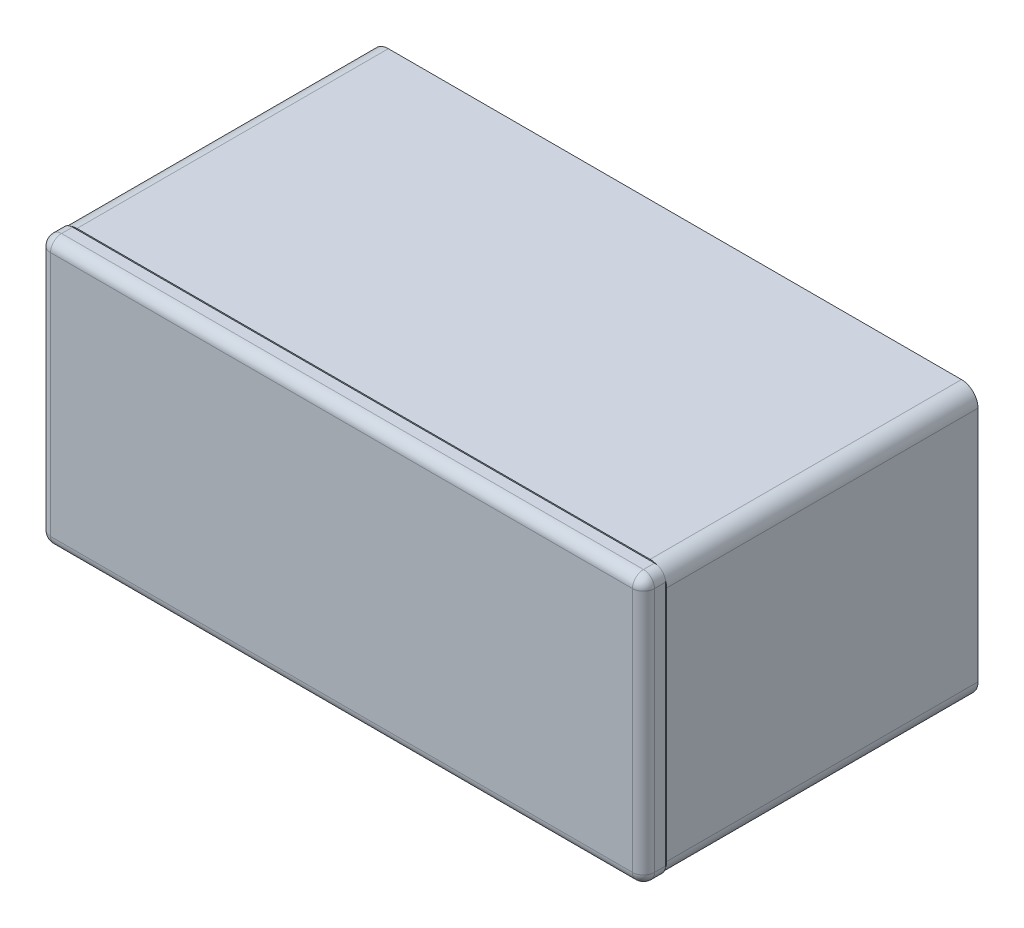
ISO-10303-21;
HEADER;
FILE_DESCRIPTION(('STEP AP214'),'2;1');
FILE_NAME('part.step','',(''),(''),'','','');
FILE_SCHEMA(('AUTOMOTIVE_DESIGN { 1 0 10303 214 1 1 1 1 }'));
ENDSEC;
DATA;
#1=APPLICATION_CONTEXT('core data for automotive mechanical design processes');
#2=APPLICATION_PROTOCOL_DEFINITION('international standard','automotive_design',2000,#1);
#3=PRODUCT_CONTEXT('',#1,'mechanical');
#4=PRODUCT('Part','Part','',(#3));
#5=PRODUCT_RELATED_PRODUCT_CATEGORY('part','',(#4));
#6=PRODUCT_DEFINITION_FORMATION('','',#4);
#7=PRODUCT_DEFINITION_CONTEXT('part definition',#1,'design');
#8=PRODUCT_DEFINITION('design','',#6,#7);
#9=PRODUCT_DEFINITION_SHAPE('','',#8);
#10=(LENGTH_UNIT() NAMED_UNIT(*) SI_UNIT(.MILLI.,.METRE.));
#11=(NAMED_UNIT(*) PLANE_ANGLE_UNIT() SI_UNIT($,.RADIAN.));
#12=(NAMED_UNIT(*) SI_UNIT($,.STERADIAN.) SOLID_ANGLE_UNIT());
#13=UNCERTAINTY_MEASURE_WITH_UNIT(LENGTH_MEASURE(1.E-05),#10,'distance_accuracy_value','');
#14=(GEOMETRIC_REPRESENTATION_CONTEXT(3) GLOBAL_UNCERTAINTY_ASSIGNED_CONTEXT((#13)) GLOBAL_UNIT_ASSIGNED_CONTEXT((#10,
#11,#12)) REPRESENTATION_CONTEXT('',''));
#15=CARTESIAN_POINT('',(0.,0.,0.));
#16=DIRECTION('',(0.,0.,1.));
#17=DIRECTION('',(1.,0.,0.));
#18=AXIS2_PLACEMENT_3D('',#15,#16,#17);
#19=CARTESIAN_POINT('',(-52.8,-22.3,58.5));
#20=DIRECTION('',(-0.707106779020598,-0.707106783352498,0.));
#21=DIRECTION('',(0.,0.,1.));
#22=AXIS2_PLACEMENT_3D('',#19,#20,#21);
#23=SPHERICAL_SURFACE('',#22,2.);
#24=CARTESIAN_POINT('',(-52.8,-22.3,58.5));
#25=DIRECTION('',(6.065092872376E-12,-6.06514838352723E-12,1.));
#26=DIRECTION('',(-0.707106779020598,-0.707106783352498,0.));
#27=AXIS2_PLACEMENT_3D('',#24,#25,#26);
#28=CIRCLE('',#27,2.);
#29=CARTESIAN_POINT('',(-54.2142135580412,-23.714213566705,58.5));
#30=VERTEX_POINT('',#29);
#31=CARTESIAN_POINT('',(-52.8,-24.3,58.4999999999939));
#32=VERTEX_POINT('',#31);
#33=EDGE_CURVE('E139',#30,#32,#28,.T.);
#34=ORIENTED_EDGE('',*,*,#33,.T.);
#35=CARTESIAN_POINT('',(-52.8,-22.3,58.5));
#36=DIRECTION('',(1.,0.,0.));
#37=DIRECTION('',(0.,0.,-1.));
#38=AXIS2_PLACEMENT_3D('',#35,#36,#37);
#39=CIRCLE('',#38,2.);
#40=CARTESIAN_POINT('',(-52.8,-22.3,60.5));
#41=VERTEX_POINT('',#40);
#42=EDGE_CURVE('E145',#41,#32,#39,.T.);
#43=ORIENTED_EDGE('',*,*,#42,.F.);
#44=CARTESIAN_POINT('',(-52.8,-22.3,58.5));
#45=DIRECTION('',(0.,-1.,0.));
#46=DIRECTION('',(0.,0.,-1.));
#47=AXIS2_PLACEMENT_3D('',#44,#45,#46);
#48=CIRCLE('',#47,2.);
#49=CARTESIAN_POINT('',(-54.8,-22.3,58.5));
#50=VERTEX_POINT('',#49);
#51=EDGE_CURVE('E142',#50,#41,#48,.F.);
#52=ORIENTED_EDGE('',*,*,#51,.F.);
#53=CARTESIAN_POINT('',(-52.8,-22.3,58.5));
#54=DIRECTION('',(0.,0.,-1.));
#55=DIRECTION('',(-1.,0.,0.));
#56=AXIS2_PLACEMENT_3D('',#53,#54,#55);
#57=CIRCLE('',#56,2.);
#58=EDGE_CURVE('E21',#50,#30,#57,.F.);
#59=ORIENTED_EDGE('',*,*,#58,.T.);
#60=EDGE_LOOP('',(#34,#43,#52,#59));
#61=FACE_BOUND('',#60,.T.);
#62=ADVANCED_FACE('F17',(#61),#23,.T.);
#63=CARTESIAN_POINT('',(52.8,-22.3,58.5));
#64=DIRECTION('',(0.707106783352498,-0.707106779020598,0.));
#65=DIRECTION('',(0.,0.,1.));
#66=AXIS2_PLACEMENT_3D('',#63,#64,#65);
#67=SPHERICAL_SURFACE('',#66,2.);
#68=CARTESIAN_POINT('',(52.8,-22.3,58.5));
#69=DIRECTION('',(8.2093221109858E-12,8.20926659983456E-12,1.));
#70=DIRECTION('',(0.707106783352498,-0.707106779020598,0.));
#71=AXIS2_PLACEMENT_3D('',#68,#69,#70);
#72=CIRCLE('',#71,2.);
#73=CARTESIAN_POINT('',(54.214213566705,-23.7142135580412,58.5));
#74=VERTEX_POINT('',#73);
#75=CARTESIAN_POINT('',(54.8,-22.3,58.4999999999918));
#76=VERTEX_POINT('',#75);
#77=EDGE_CURVE('E183',#74,#76,#72,.T.);
#78=ORIENTED_EDGE('',*,*,#77,.T.);
#79=CARTESIAN_POINT('',(52.8,-22.3,58.5));
#80=DIRECTION('',(0.,1.,0.));
#81=DIRECTION('',(0.,0.,1.));
#82=AXIS2_PLACEMENT_3D('',#79,#80,#81);
#83=CIRCLE('',#82,2.);
#84=CARTESIAN_POINT('',(52.8,-22.3,60.5));
#85=VERTEX_POINT('',#84);
#86=EDGE_CURVE('E149',#85,#76,#83,.T.);
#87=ORIENTED_EDGE('',*,*,#86,.F.);
#88=CARTESIAN_POINT('',(52.8,-22.3,58.5));
#89=DIRECTION('',(1.,0.,0.));
#90=DIRECTION('',(0.,0.,-1.));
#91=AXIS2_PLACEMENT_3D('',#88,#89,#90);
#92=CIRCLE('',#91,2.);
#93=CARTESIAN_POINT('',(52.8,-24.3,58.5));
#94=VERTEX_POINT('',#93);
#95=EDGE_CURVE('E150',#94,#85,#92,.F.);
#96=ORIENTED_EDGE('',*,*,#95,.F.);
#97=CARTESIAN_POINT('',(52.8,-22.3,58.5));
#98=DIRECTION('',(0.,0.,-1.));
#99=DIRECTION('',(-1.,0.,0.));
#100=AXIS2_PLACEMENT_3D('',#97,#98,#99);
#101=CIRCLE('',#100,2.);
#102=EDGE_CURVE('E271',#94,#74,#101,.F.);
#103=ORIENTED_EDGE('',*,*,#102,.T.);
#104=EDGE_LOOP('',(#78,#87,#96,#103));
#105=FACE_BOUND('',#104,.T.);
#106=ADVANCED_FACE('F184',(#105),#67,.T.);
#107=CARTESIAN_POINT('',(-53.00721512968,-22.3,58.5));
#108=DIRECTION('',(1.,0.,0.));
#109=DIRECTION('',(0.,0.,-1.));
#110=AXIS2_PLACEMENT_3D('',#107,#108,#109);
#111=CYLINDRICAL_SURFACE('',#110,2.);
#112=ORIENTED_EDGE('',*,*,#95,.T.);
#113=DIRECTION('',(1.,0.,0.));
#114=VECTOR('',#113,1.);
#115=CARTESIAN_POINT('',(0.,-22.3,60.5));
#116=LINE('',#115,#114);
#117=EDGE_CURVE('E175',#41,#85,#116,.T.);
#118=ORIENTED_EDGE('',*,*,#117,.F.);
#119=ORIENTED_EDGE('',*,*,#42,.T.);
#120=DIRECTION('',(1.,0.,0.));
#121=VECTOR('',#120,1.);
#122=CARTESIAN_POINT('',(-54.8,-24.3,58.5));
#123=LINE('',#122,#121);
#124=EDGE_CURVE('E172',#94,#32,#123,.F.);
#125=ORIENTED_EDGE('',*,*,#124,.F.);
#126=EDGE_LOOP('',(#112,#118,#119,#125));
#127=FACE_BOUND('',#126,.T.);
#128=ADVANCED_FACE('F187',(#127),#111,.T.);
#129=CARTESIAN_POINT('',(-52.8,22.50721512968,58.5));
#130=DIRECTION('',(0.,-1.,0.));
#131=DIRECTION('',(0.,0.,-1.));
#132=AXIS2_PLACEMENT_3D('',#129,#130,#131);
#133=CYLINDRICAL_SURFACE('',#132,2.);
#134=ORIENTED_EDGE('',*,*,#51,.T.);
#135=DIRECTION('',(0.,1.,0.));
#136=VECTOR('',#135,1.);
#137=CARTESIAN_POINT('',(-52.8,0.,60.5));
#138=LINE('',#137,#136);
#139=CARTESIAN_POINT('',(-52.8,22.3,60.5));
#140=VERTEX_POINT('',#139);
#141=EDGE_CURVE('E221',#140,#41,#138,.F.);
#142=ORIENTED_EDGE('',*,*,#141,.F.);
#143=CARTESIAN_POINT('',(-52.8,22.3,58.5));
#144=DIRECTION('',(0.,-1.,0.));
#145=DIRECTION('',(0.,0.,-1.));
#146=AXIS2_PLACEMENT_3D('',#143,#144,#145);
#147=CIRCLE('',#146,2.);
#148=CARTESIAN_POINT('',(-54.8,22.3,58.5));
#149=VERTEX_POINT('',#148);
#150=EDGE_CURVE('E156',#149,#140,#147,.F.);
#151=ORIENTED_EDGE('',*,*,#150,.F.);
#152=DIRECTION('',(0.,1.,0.));
#153=VECTOR('',#152,1.);
#154=CARTESIAN_POINT('',(-54.8,24.3,58.5));
#155=LINE('',#154,#153);
#156=EDGE_CURVE('E153',#50,#149,#155,.T.);
#157=ORIENTED_EDGE('',*,*,#156,.F.);
#158=EDGE_LOOP('',(#134,#142,#151,#157));
#159=FACE_BOUND('',#158,.T.);
#160=ADVANCED_FACE('F154',(#159),#133,.T.);
#161=CARTESIAN_POINT('',(52.8,-22.50721512968,58.5));
#162=DIRECTION('',(0.,1.,0.));
#163=DIRECTION('',(0.,0.,1.));
#164=AXIS2_PLACEMENT_3D('',#161,#162,#163);
#165=CYLINDRICAL_SURFACE('',#164,2.);
#166=CARTESIAN_POINT('',(52.8,22.3,58.5));
#167=DIRECTION('',(0.,1.,0.));
#168=DIRECTION('',(0.,0.,1.));
#169=AXIS2_PLACEMENT_3D('',#166,#167,#168);
#170=CIRCLE('',#169,2.);
#171=CARTESIAN_POINT('',(52.8,22.3,60.5));
#172=VERTEX_POINT('',#171);
#173=CARTESIAN_POINT('',(54.8,22.3,58.5));
#174=VERTEX_POINT('',#173);
#175=EDGE_CURVE('E159',#172,#174,#170,.T.);
#176=ORIENTED_EDGE('',*,*,#175,.F.);
#177=DIRECTION('',(0.,1.,0.));
#178=VECTOR('',#177,1.);
#179=CARTESIAN_POINT('',(52.8,0.,60.5));
#180=LINE('',#179,#178);
#181=EDGE_CURVE('E178',#85,#172,#180,.T.);
#182=ORIENTED_EDGE('',*,*,#181,.F.);
#183=ORIENTED_EDGE('',*,*,#86,.T.);
#184=DIRECTION('',(0.,1.,0.));
#185=VECTOR('',#184,1.);
#186=CARTESIAN_POINT('',(54.8,-24.3,58.5));
#187=LINE('',#186,#185);
#188=EDGE_CURVE('E258',#174,#76,#187,.F.);
#189=ORIENTED_EDGE('',*,*,#188,.F.);
#190=EDGE_LOOP('',(#176,#182,#183,#189));
#191=FACE_BOUND('',#190,.T.);
#192=ADVANCED_FACE('F194',(#191),#165,.T.);
#193=CARTESIAN_POINT('',(-52.8,-22.3,60.71086977455));
#194=DIRECTION('',(0.,0.,-1.));
#195=DIRECTION('',(-1.,0.,0.));
#196=AXIS2_PLACEMENT_3D('',#193,#194,#195);
#197=CYLINDRICAL_SURFACE('',#196,2.);
#198=DIRECTION('',(0.,0.,-1.));
#199=VECTOR('',#198,1.);
#200=CARTESIAN_POINT('',(-52.8,-24.3,56.5));
#201=LINE('',#200,#199);
#202=CARTESIAN_POINT('',(-52.8,-24.3,56.5));
#203=VERTEX_POINT('',#202);
#204=EDGE_CURVE('E169',#32,#203,#201,.T.);
#205=ORIENTED_EDGE('',*,*,#204,.F.);
#206=ORIENTED_EDGE('',*,*,#33,.F.);
#207=ORIENTED_EDGE('',*,*,#58,.F.);
#208=DIRECTION('',(0.,0.,1.));
#209=VECTOR('',#208,1.);
#210=CARTESIAN_POINT('',(-54.8,-22.3,56.5));
#211=LINE('',#210,#209);
#212=CARTESIAN_POINT('',(-54.8,-22.3,56.5));
#213=VERTEX_POINT('',#212);
#214=EDGE_CURVE('E137',#213,#50,#211,.T.);
#215=ORIENTED_EDGE('',*,*,#214,.F.);
#216=CARTESIAN_POINT('',(-52.8,-22.3,56.5));
#217=DIRECTION('',(0.,0.,-1.));
#218=DIRECTION('',(-1.,0.,0.));
#219=AXIS2_PLACEMENT_3D('',#216,#217,#218);
#220=CIRCLE('',#219,2.);
#221=CARTESIAN_POINT('',(-54.7678531833917,-22.6571468166091,56.5));
#222=VERTEX_POINT('',#221);
#223=EDGE_CURVE('E265',#213,#222,#220,.F.);
#224=ORIENTED_EDGE('',*,*,#223,.T.);
#225=CARTESIAN_POINT('',(-52.8,-22.3,56.5));
#226=DIRECTION('',(0.,0.,-1.));
#227=DIRECTION('',(-1.,0.,0.));
#228=AXIS2_PLACEMENT_3D('',#225,#226,#227);
#229=CIRCLE('',#228,2.);
#230=CARTESIAN_POINT('',(-53.1571468166091,-24.2678531833917,56.5));
#231=VERTEX_POINT('',#230);
#232=EDGE_CURVE('E255',#222,#231,#229,.F.);
#233=ORIENTED_EDGE('',*,*,#232,.T.);
#234=CARTESIAN_POINT('',(-52.8,-22.3,56.5));
#235=DIRECTION('',(0.,0.,-1.));
#236=DIRECTION('',(-1.,0.,0.));
#237=AXIS2_PLACEMENT_3D('',#234,#235,#236);
#238=CIRCLE('',#237,2.);
#239=EDGE_CURVE('E173',#231,#203,#238,.F.);
#240=ORIENTED_EDGE('',*,*,#239,.T.);
#241=EDGE_LOOP('',(#205,#206,#207,#215,#224,#233,#240));
#242=FACE_BOUND('',#241,.T.);
#243=ADVANCED_FACE('F135',(#242),#197,.T.);
#244=CARTESIAN_POINT('',(-54.8,-24.3,56.5));
#245=DIRECTION('',(0.,-1.,0.));
#246=DIRECTION('',(0.,0.,-1.));
#247=AXIS2_PLACEMENT_3D('',#244,#245,#246);
#248=PLANE('',#247);
#249=DIRECTION('',(0.,0.,-1.));
#250=VECTOR('',#249,1.);
#251=CARTESIAN_POINT('',(52.8,-24.3,60.71086977455));
#252=LINE('',#251,#250);
#253=CARTESIAN_POINT('',(52.8,-24.3,56.5));
#254=VERTEX_POINT('',#253);
#255=EDGE_CURVE('E165',#94,#254,#252,.T.);
#256=ORIENTED_EDGE('',*,*,#255,.F.);
#257=ORIENTED_EDGE('',*,*,#124,.T.);
#258=ORIENTED_EDGE('',*,*,#204,.T.);
#259=DIRECTION('',(1.,0.,0.));
#260=VECTOR('',#259,1.);
#261=CARTESIAN_POINT('',(0.,-24.3,56.5));
#262=LINE('',#261,#260);
#263=EDGE_CURVE('E248',#254,#203,#262,.F.);
#264=ORIENTED_EDGE('',*,*,#263,.F.);
#265=EDGE_LOOP('',(#256,#257,#258,#264));
#266=FACE_BOUND('',#265,.T.);
#267=ADVANCED_FACE('F200',(#266),#248,.T.);
#268=CARTESIAN_POINT('',(52.8,-22.3,60.71086977455));
#269=DIRECTION('',(0.,0.,-1.));
#270=DIRECTION('',(-1.,0.,0.));
#271=AXIS2_PLACEMENT_3D('',#268,#269,#270);
#272=CYLINDRICAL_SURFACE('',#271,2.);
#273=DIRECTION('',(0.,0.,-1.));
#274=VECTOR('',#273,1.);
#275=CARTESIAN_POINT('',(54.8,-22.3,56.5));
#276=LINE('',#275,#274);
#277=CARTESIAN_POINT('',(54.8,-22.3,56.5));
#278=VERTEX_POINT('',#277);
#279=EDGE_CURVE('E397',#76,#278,#276,.T.);
#280=ORIENTED_EDGE('',*,*,#279,.F.);
#281=ORIENTED_EDGE('',*,*,#77,.F.);
#282=ORIENTED_EDGE('',*,*,#102,.F.);
#283=ORIENTED_EDGE('',*,*,#255,.T.);
#284=CARTESIAN_POINT('',(52.8,-22.3,56.5));
#285=DIRECTION('',(0.,0.,-1.));
#286=DIRECTION('',(-1.,0.,0.));
#287=AXIS2_PLACEMENT_3D('',#284,#285,#286);
#288=CIRCLE('',#287,2.);
#289=CARTESIAN_POINT('',(53.1571468166091,-24.2678531833917,56.5));
#290=VERTEX_POINT('',#289);
#291=EDGE_CURVE('E249',#290,#254,#288,.T.);
#292=ORIENTED_EDGE('',*,*,#291,.F.);
#293=CARTESIAN_POINT('',(52.8,-22.3,56.5));
#294=DIRECTION('',(0.,0.,-1.));
#295=DIRECTION('',(-1.,0.,0.));
#296=AXIS2_PLACEMENT_3D('',#293,#294,#295);
#297=CIRCLE('',#296,2.);
#298=CARTESIAN_POINT('',(54.7678531833917,-22.6571468166091,56.5));
#299=VERTEX_POINT('',#298);
#300=EDGE_CURVE('E245',#290,#299,#297,.F.);
#301=ORIENTED_EDGE('',*,*,#300,.T.);
#302=CARTESIAN_POINT('',(52.8,-22.3,56.5));
#303=DIRECTION('',(0.,0.,-1.));
#304=DIRECTION('',(-1.,0.,0.));
#305=AXIS2_PLACEMENT_3D('',#302,#303,#304);
#306=CIRCLE('',#305,2.);
#307=EDGE_CURVE('E163',#299,#278,#306,.F.);
#308=ORIENTED_EDGE('',*,*,#307,.T.);
#309=EDGE_LOOP('',(#280,#281,#282,#283,#292,#301,#308));
#310=FACE_BOUND('',#309,.T.);
#311=ADVANCED_FACE('F203',(#310),#272,.T.);
#312=CARTESIAN_POINT('',(-54.8,24.3,56.5));
#313=DIRECTION('',(-1.,0.,0.));
#314=DIRECTION('',(0.,0.,1.));
#315=AXIS2_PLACEMENT_3D('',#312,#313,#314);
#316=PLANE('',#315);
#317=ORIENTED_EDGE('',*,*,#214,.T.);
#318=ORIENTED_EDGE('',*,*,#156,.T.);
#319=DIRECTION('',(0.,0.,-1.));
#320=VECTOR('',#319,1.);
#321=CARTESIAN_POINT('',(-54.8,22.3,60.71086977455));
#322=LINE('',#321,#320);
#323=CARTESIAN_POINT('',(-54.8,22.3,56.5));
#324=VERTEX_POINT('',#323);
#325=EDGE_CURVE('E228',#324,#149,#322,.F.);
#326=ORIENTED_EDGE('',*,*,#325,.F.);
#327=DIRECTION('',(0.,1.,0.));
#328=VECTOR('',#327,1.);
#329=CARTESIAN_POINT('',(-54.8,0.,56.5));
#330=LINE('',#329,#328);
#331=EDGE_CURVE('E162',#213,#324,#330,.T.);
#332=ORIENTED_EDGE('',*,*,#331,.F.);
#333=EDGE_LOOP('',(#317,#318,#326,#332));
#334=FACE_BOUND('',#333,.T.);
#335=ADVANCED_FACE('F161',(#334),#316,.T.);
#336=CARTESIAN_POINT('',(52.8,22.3,58.5));
#337=DIRECTION('',(0.707106779020598,0.707106783352498,0.));
#338=DIRECTION('',(0.,0.,1.));
#339=AXIS2_PLACEMENT_3D('',#336,#337,#338);
#340=SPHERICAL_SURFACE('',#339,2.);
#341=CARTESIAN_POINT('',(52.8,22.3,58.5));
#342=DIRECTION('',(-6.065092872376E-12,6.06514838352723E-12,1.));
#343=DIRECTION('',(0.707106779020598,0.707106783352498,0.));
#344=AXIS2_PLACEMENT_3D('',#341,#342,#343);
#345=CIRCLE('',#344,2.);
#346=CARTESIAN_POINT('',(54.2142135580412,23.714213566705,58.5));
#347=VERTEX_POINT('',#346);
#348=CARTESIAN_POINT('',(52.8,24.3,58.4999999999939));
#349=VERTEX_POINT('',#348);
#350=EDGE_CURVE('E223',#347,#349,#345,.T.);
#351=ORIENTED_EDGE('',*,*,#350,.T.);
#352=CARTESIAN_POINT('',(52.8,22.3,58.5));
#353=DIRECTION('',(-1.,0.,0.));
#354=DIRECTION('',(0.,0.,1.));
#355=AXIS2_PLACEMENT_3D('',#352,#353,#354);
#356=CIRCLE('',#355,2.);
#357=EDGE_CURVE('E348',#172,#349,#356,.T.);
#358=ORIENTED_EDGE('',*,*,#357,.F.);
#359=ORIENTED_EDGE('',*,*,#175,.T.);
#360=CARTESIAN_POINT('',(52.8,22.3,58.5));
#361=DIRECTION('',(0.,0.,-1.));
#362=DIRECTION('',(-1.,0.,0.));
#363=AXIS2_PLACEMENT_3D('',#360,#361,#362);
#364=CIRCLE('',#363,2.);
#365=EDGE_CURVE('E226',#174,#347,#364,.F.);
#366=ORIENTED_EDGE('',*,*,#365,.T.);
#367=EDGE_LOOP('',(#351,#358,#359,#366));
#368=FACE_BOUND('',#367,.T.);
#369=ADVANCED_FACE('F210',(#368),#340,.T.);
#370=CARTESIAN_POINT('',(-52.8,22.3,58.5));
#371=DIRECTION('',(-0.707106783352498,0.707106779020598,0.));
#372=DIRECTION('',(0.,0.,1.));
#373=AXIS2_PLACEMENT_3D('',#370,#371,#372);
#374=SPHERICAL_SURFACE('',#373,2.);
#375=ORIENTED_EDGE('',*,*,#150,.T.);
#376=CARTESIAN_POINT('',(-52.8,22.3,58.5));
#377=DIRECTION('',(-1.,0.,0.));
#378=DIRECTION('',(0.,0.,1.));
#379=AXIS2_PLACEMENT_3D('',#376,#377,#378);
#380=CIRCLE('',#379,2.);
#381=CARTESIAN_POINT('',(-52.8,24.3,58.5));
#382=VERTEX_POINT('',#381);
#383=EDGE_CURVE('E346',#382,#140,#380,.F.);
#384=ORIENTED_EDGE('',*,*,#383,.F.);
#385=CARTESIAN_POINT('',(-52.8,22.3,58.5));
#386=DIRECTION('',(0.,0.,-1.));
#387=DIRECTION('',(-1.,0.,0.));
#388=AXIS2_PLACEMENT_3D('',#385,#386,#387);
#389=CIRCLE('',#388,2.);
#390=CARTESIAN_POINT('',(-54.214213566705,23.7142135580412,58.5));
#391=VERTEX_POINT('',#390);
#392=EDGE_CURVE('E36',#391,#382,#389,.T.);
#393=ORIENTED_EDGE('',*,*,#392,.F.);
#394=CARTESIAN_POINT('',(-52.8,22.3,58.5));
#395=DIRECTION('',(0.,0.,-1.));
#396=DIRECTION('',(-1.,0.,0.));
#397=AXIS2_PLACEMENT_3D('',#394,#395,#396);
#398=CIRCLE('',#397,2.);
#399=EDGE_CURVE('E230',#149,#391,#398,.T.);
#400=ORIENTED_EDGE('',*,*,#399,.F.);
#401=EDGE_LOOP('',(#375,#384,#393,#400));
#402=FACE_BOUND('',#401,.T.);
#403=ADVANCED_FACE('F214',(#402),#374,.T.);
#404=CARTESIAN_POINT('',(0.,0.,60.5));
#405=DIRECTION('',(0.,0.,1.));
#406=DIRECTION('',(1.,0.,0.));
#407=AXIS2_PLACEMENT_3D('',#404,#405,#406);
#408=PLANE('',#407);
#409=DIRECTION('',(-1.,0.,0.));
#410=VECTOR('',#409,1.);
#411=CARTESIAN_POINT('',(53.00721512968,22.3,60.5));
#412=LINE('',#411,#410);
#413=EDGE_CURVE('E345',#140,#172,#412,.F.);
#414=ORIENTED_EDGE('',*,*,#413,.F.);
#415=ORIENTED_EDGE('',*,*,#141,.T.);
#416=ORIENTED_EDGE('',*,*,#117,.T.);
#417=ORIENTED_EDGE('',*,*,#181,.T.);
#418=EDGE_LOOP('',(#414,#415,#416,#417));
#419=FACE_BOUND('',#418,.T.);
#420=ADVANCED_FACE('F402',(#419),#408,.T.);
#421=CARTESIAN_POINT('',(54.8,-24.3,56.5));
#422=DIRECTION('',(1.,0.,0.));
#423=DIRECTION('',(0.,0.,-1.));
#424=AXIS2_PLACEMENT_3D('',#421,#422,#423);
#425=PLANE('',#424);
#426=DIRECTION('',(0.,0.,-1.));
#427=VECTOR('',#426,1.);
#428=CARTESIAN_POINT('',(54.8,22.3,60.71086977455));
#429=LINE('',#428,#427);
#430=CARTESIAN_POINT('',(54.8,22.3,56.5));
#431=VERTEX_POINT('',#430);
#432=EDGE_CURVE('E340',#174,#431,#429,.T.);
#433=ORIENTED_EDGE('',*,*,#432,.F.);
#434=ORIENTED_EDGE('',*,*,#188,.T.);
#435=ORIENTED_EDGE('',*,*,#279,.T.);
#436=DIRECTION('',(0.,1.,0.));
#437=VECTOR('',#436,1.);
#438=CARTESIAN_POINT('',(54.8,0.,56.5));
#439=LINE('',#438,#437);
#440=EDGE_CURVE('E344',#431,#278,#439,.F.);
#441=ORIENTED_EDGE('',*,*,#440,.F.);
#442=EDGE_LOOP('',(#433,#434,#435,#441));
#443=FACE_BOUND('',#442,.T.);
#444=ADVANCED_FACE('F560',(#443),#425,.T.);
#445=CARTESIAN_POINT('',(0.,0.,56.5));
#446=DIRECTION('',(0.,0.,1.));
#447=DIRECTION('',(1.,0.,0.));
#448=AXIS2_PLACEMENT_3D('',#445,#446,#447);
#449=PLANE('',#448);
#450=ORIENTED_EDGE('',*,*,#232,.F.);
#451=CARTESIAN_POINT('',(-52.,-21.5,56.5));
#452=DIRECTION('',(0.,0.,-1.));
#453=DIRECTION('',(-1.,0.,0.));
#454=AXIS2_PLACEMENT_3D('',#451,#452,#453);
#455=CIRCLE('',#454,3.);
#456=EDGE_CURVE('E328',#231,#222,#455,.T.);
#457=ORIENTED_EDGE('',*,*,#456,.F.);
#458=EDGE_LOOP('',(#450,#457));
#459=FACE_BOUND('',#458,.T.);
#460=ADVANCED_FACE('F461',(#459),#449,.F.);
#461=CARTESIAN_POINT('',(0.,0.,56.5));
#462=DIRECTION('',(0.,0.,1.));
#463=DIRECTION('',(1.,0.,0.));
#464=AXIS2_PLACEMENT_3D('',#461,#462,#463);
#465=PLANE('',#464);
#466=ORIENTED_EDGE('',*,*,#239,.F.);
#467=CARTESIAN_POINT('',(-52.,-21.5,56.5));
#468=DIRECTION('',(0.,0.,-1.));
#469=DIRECTION('',(-1.,0.,0.));
#470=AXIS2_PLACEMENT_3D('',#467,#468,#469);
#471=CIRCLE('',#470,3.);
#472=CARTESIAN_POINT('',(-52.,-24.5,56.5));
#473=VERTEX_POINT('',#472);
#474=EDGE_CURVE('E331',#473,#231,#471,.T.);
#475=ORIENTED_EDGE('',*,*,#474,.F.);
#476=DIRECTION('',(1.,0.,0.));
#477=VECTOR('',#476,1.);
#478=CARTESIAN_POINT('',(-55.,-24.5,56.5));
#479=LINE('',#478,#477);
#480=CARTESIAN_POINT('',(52.,-24.5,56.5));
#481=VERTEX_POINT('',#480);
#482=EDGE_CURVE('E327',#481,#473,#479,.F.);
#483=ORIENTED_EDGE('',*,*,#482,.F.);
#484=CARTESIAN_POINT('',(52.,-21.5,56.5));
#485=DIRECTION('',(0.,0.,-1.));
#486=DIRECTION('',(-1.,0.,0.));
#487=AXIS2_PLACEMENT_3D('',#484,#485,#486);
#488=CIRCLE('',#487,3.);
#489=EDGE_CURVE('E252',#481,#290,#488,.F.);
#490=ORIENTED_EDGE('',*,*,#489,.T.);
#491=ORIENTED_EDGE('',*,*,#291,.T.);
#492=ORIENTED_EDGE('',*,*,#263,.T.);
#493=EDGE_LOOP('',(#466,#475,#483,#490,#491,#492));
#494=FACE_BOUND('',#493,.T.);
#495=ADVANCED_FACE('F455',(#494),#465,.T.);
#496=CARTESIAN_POINT('',(0.,0.,56.5));
#497=DIRECTION('',(0.,0.,1.));
#498=DIRECTION('',(1.,0.,0.));
#499=AXIS2_PLACEMENT_3D('',#496,#497,#498);
#500=PLANE('',#499);
#501=ORIENTED_EDGE('',*,*,#300,.F.);
#502=CARTESIAN_POINT('',(52.,-21.5,56.5));
#503=DIRECTION('',(0.,0.,-1.));
#504=DIRECTION('',(-1.,0.,0.));
#505=AXIS2_PLACEMENT_3D('',#502,#503,#504);
#506=CIRCLE('',#505,3.);
#507=EDGE_CURVE('E316',#299,#290,#506,.T.);
#508=ORIENTED_EDGE('',*,*,#507,.F.);
#509=EDGE_LOOP('',(#501,#508));
#510=FACE_BOUND('',#509,.T.);
#511=ADVANCED_FACE('F552',(#510),#500,.F.);
#512=CARTESIAN_POINT('',(0.,0.,56.5));
#513=DIRECTION('',(0.,0.,1.));
#514=DIRECTION('',(1.,0.,0.));
#515=AXIS2_PLACEMENT_3D('',#512,#513,#514);
#516=PLANE('',#515);
#517=ORIENTED_EDGE('',*,*,#223,.F.);
#518=ORIENTED_EDGE('',*,*,#331,.T.);
#519=CARTESIAN_POINT('',(-52.8,22.3,56.5));
#520=DIRECTION('',(0.,0.,-1.));
#521=DIRECTION('',(-1.,0.,0.));
#522=AXIS2_PLACEMENT_3D('',#519,#520,#521);
#523=CIRCLE('',#522,2.);
#524=CARTESIAN_POINT('',(-54.7678531833917,22.6571468166091,56.5));
#525=VERTEX_POINT('',#524);
#526=EDGE_CURVE('E231',#525,#324,#523,.F.);
#527=ORIENTED_EDGE('',*,*,#526,.F.);
#528=CARTESIAN_POINT('',(-52.,21.5,56.5));
#529=DIRECTION('',(0.,0.,-1.));
#530=DIRECTION('',(-1.,0.,0.));
#531=AXIS2_PLACEMENT_3D('',#528,#529,#530);
#532=CIRCLE('',#531,3.);
#533=CARTESIAN_POINT('',(-55.,21.5,56.5));
#534=VERTEX_POINT('',#533);
#535=EDGE_CURVE('E243',#525,#534,#532,.F.);
#536=ORIENTED_EDGE('',*,*,#535,.T.);
#537=DIRECTION('',(0.,1.,0.));
#538=VECTOR('',#537,1.);
#539=CARTESIAN_POINT('',(-55.,24.5,56.5));
#540=LINE('',#539,#538);
#541=CARTESIAN_POINT('',(-55.,-21.5,56.5));
#542=VERTEX_POINT('',#541);
#543=EDGE_CURVE('E315',#542,#534,#540,.T.);
#544=ORIENTED_EDGE('',*,*,#543,.F.);
#545=CARTESIAN_POINT('',(-52.,-21.5,56.5));
#546=DIRECTION('',(0.,0.,-1.));
#547=DIRECTION('',(-1.,0.,0.));
#548=AXIS2_PLACEMENT_3D('',#545,#546,#547);
#549=CIRCLE('',#548,3.);
#550=EDGE_CURVE('E324',#222,#542,#549,.T.);
#551=ORIENTED_EDGE('',*,*,#550,.F.);
#552=EDGE_LOOP('',(#517,#518,#527,#536,#544,#551));
#553=FACE_BOUND('',#552,.T.);
#554=ADVANCED_FACE('F463',(#553),#516,.T.);
#555=CARTESIAN_POINT('',(-52.8,22.3,60.71086977455));
#556=DIRECTION('',(0.,0.,-1.));
#557=DIRECTION('',(-1.,0.,0.));
#558=AXIS2_PLACEMENT_3D('',#555,#556,#557);
#559=CYLINDRICAL_SURFACE('',#558,2.);
#560=ORIENTED_EDGE('',*,*,#325,.T.);
#561=ORIENTED_EDGE('',*,*,#399,.T.);
#562=ORIENTED_EDGE('',*,*,#392,.T.);
#563=DIRECTION('',(0.,0.,1.));
#564=VECTOR('',#563,1.);
#565=CARTESIAN_POINT('',(-52.8,24.3,56.5));
#566=LINE('',#565,#564);
#567=CARTESIAN_POINT('',(-52.8,24.3,56.5));
#568=VERTEX_POINT('',#567);
#569=EDGE_CURVE('E358',#568,#382,#566,.T.);
#570=ORIENTED_EDGE('',*,*,#569,.F.);
#571=CARTESIAN_POINT('',(-52.8,22.3,56.5));
#572=DIRECTION('',(0.,0.,-1.));
#573=DIRECTION('',(-1.,0.,0.));
#574=AXIS2_PLACEMENT_3D('',#571,#572,#573);
#575=CIRCLE('',#574,2.);
#576=CARTESIAN_POINT('',(-53.1571468166091,24.2678531833917,56.5));
#577=VERTEX_POINT('',#576);
#578=EDGE_CURVE('E235',#568,#577,#575,.F.);
#579=ORIENTED_EDGE('',*,*,#578,.T.);
#580=CARTESIAN_POINT('',(-52.8,22.3,56.5));
#581=DIRECTION('',(0.,0.,-1.));
#582=DIRECTION('',(-1.,0.,0.));
#583=AXIS2_PLACEMENT_3D('',#580,#581,#582);
#584=CIRCLE('',#583,2.);
#585=EDGE_CURVE('E312',#577,#525,#584,.F.);
#586=ORIENTED_EDGE('',*,*,#585,.T.);
#587=ORIENTED_EDGE('',*,*,#526,.T.);
#588=EDGE_LOOP('',(#560,#561,#562,#570,#579,#586,#587));
#589=FACE_BOUND('',#588,.T.);
#590=ADVANCED_FACE('F356',(#589),#559,.T.);
#591=CARTESIAN_POINT('',(53.00721512968,22.3,58.5));
#592=DIRECTION('',(-1.,0.,0.));
#593=DIRECTION('',(0.,0.,1.));
#594=AXIS2_PLACEMENT_3D('',#591,#592,#593);
#595=CYLINDRICAL_SURFACE('',#594,2.);
#596=ORIENTED_EDGE('',*,*,#383,.T.);
#597=ORIENTED_EDGE('',*,*,#413,.T.);
#598=ORIENTED_EDGE('',*,*,#357,.T.);
#599=DIRECTION('',(1.,0.,0.));
#600=VECTOR('',#599,1.);
#601=CARTESIAN_POINT('',(54.8,24.3,58.5));
#602=LINE('',#601,#600);
#603=EDGE_CURVE('E360',#382,#349,#602,.T.);
#604=ORIENTED_EDGE('',*,*,#603,.F.);
#605=EDGE_LOOP('',(#596,#597,#598,#604));
#606=FACE_BOUND('',#605,.T.);
#607=ADVANCED_FACE('F361',(#606),#595,.T.);
#608=CARTESIAN_POINT('',(0.,0.,56.5));
#609=DIRECTION('',(0.,0.,1.));
#610=DIRECTION('',(1.,0.,0.));
#611=AXIS2_PLACEMENT_3D('',#608,#609,#610);
#612=PLANE('',#611);
#613=ORIENTED_EDGE('',*,*,#307,.F.);
#614=CARTESIAN_POINT('',(52.,-21.5,56.5));
#615=DIRECTION('',(0.,0.,-1.));
#616=DIRECTION('',(-1.,0.,0.));
#617=AXIS2_PLACEMENT_3D('',#614,#615,#616);
#618=CIRCLE('',#617,3.);
#619=CARTESIAN_POINT('',(55.,-21.5,56.5));
#620=VERTEX_POINT('',#619);
#621=EDGE_CURVE('E320',#620,#299,#618,.T.);
#622=ORIENTED_EDGE('',*,*,#621,.F.);
#623=DIRECTION('',(0.,1.,0.));
#624=VECTOR('',#623,1.);
#625=CARTESIAN_POINT('',(55.,-24.5,56.5));
#626=LINE('',#625,#624);
#627=CARTESIAN_POINT('',(55.,21.5,56.5));
#628=VERTEX_POINT('',#627);
#629=EDGE_CURVE('E364',#628,#620,#626,.F.);
#630=ORIENTED_EDGE('',*,*,#629,.F.);
#631=CARTESIAN_POINT('',(52.,21.5,56.5));
#632=DIRECTION('',(0.,0.,-1.));
#633=DIRECTION('',(-1.,0.,0.));
#634=AXIS2_PLACEMENT_3D('',#631,#632,#633);
#635=CIRCLE('',#634,3.);
#636=CARTESIAN_POINT('',(54.7678531833917,22.6571468166091,56.5));
#637=VERTEX_POINT('',#636);
#638=EDGE_CURVE('E341',#628,#637,#635,.F.);
#639=ORIENTED_EDGE('',*,*,#638,.T.);
#640=CARTESIAN_POINT('',(52.8,22.3,56.5));
#641=DIRECTION('',(0.,0.,-1.));
#642=DIRECTION('',(-1.,0.,0.));
#643=AXIS2_PLACEMENT_3D('',#640,#641,#642);
#644=CIRCLE('',#643,2.);
#645=EDGE_CURVE('E337',#431,#637,#644,.F.);
#646=ORIENTED_EDGE('',*,*,#645,.F.);
#647=ORIENTED_EDGE('',*,*,#440,.T.);
#648=EDGE_LOOP('',(#613,#622,#630,#639,#646,#647));
#649=FACE_BOUND('',#648,.T.);
#650=ADVANCED_FACE('F492',(#649),#612,.T.);
#651=CARTESIAN_POINT('',(52.8,22.3,60.71086977455));
#652=DIRECTION('',(0.,0.,-1.));
#653=DIRECTION('',(-1.,0.,0.));
#654=AXIS2_PLACEMENT_3D('',#651,#652,#653);
#655=CYLINDRICAL_SURFACE('',#654,2.);
#656=DIRECTION('',(0.,0.,1.));
#657=VECTOR('',#656,1.);
#658=CARTESIAN_POINT('',(52.8,24.3,56.5));
#659=LINE('',#658,#657);
#660=CARTESIAN_POINT('',(52.8,24.3,56.5));
#661=VERTEX_POINT('',#660);
#662=EDGE_CURVE('E314',#349,#661,#659,.F.);
#663=ORIENTED_EDGE('',*,*,#662,.F.);
#664=ORIENTED_EDGE('',*,*,#350,.F.);
#665=ORIENTED_EDGE('',*,*,#365,.F.);
#666=ORIENTED_EDGE('',*,*,#432,.T.);
#667=ORIENTED_EDGE('',*,*,#645,.T.);
#668=CARTESIAN_POINT('',(52.8,22.3,56.5));
#669=DIRECTION('',(0.,0.,-1.));
#670=DIRECTION('',(-1.,0.,0.));
#671=AXIS2_PLACEMENT_3D('',#668,#669,#670);
#672=CIRCLE('',#671,2.);
#673=CARTESIAN_POINT('',(53.1571468166091,24.2678531833917,56.5));
#674=VERTEX_POINT('',#673);
#675=EDGE_CURVE('E308',#637,#674,#672,.F.);
#676=ORIENTED_EDGE('',*,*,#675,.T.);
#677=CARTESIAN_POINT('',(52.8,22.3,56.5));
#678=DIRECTION('',(0.,0.,-1.));
#679=DIRECTION('',(-1.,0.,0.));
#680=AXIS2_PLACEMENT_3D('',#677,#678,#679);
#681=CIRCLE('',#680,2.);
#682=EDGE_CURVE('E334',#674,#661,#681,.F.);
#683=ORIENTED_EDGE('',*,*,#682,.T.);
#684=EDGE_LOOP('',(#663,#664,#665,#666,#667,#676,#683));
#685=FACE_BOUND('',#684,.T.);
#686=ADVANCED_FACE('F407',(#685),#655,.T.);
#687=CARTESIAN_POINT('',(-52.,-21.5,56.71086977455));
#688=DIRECTION('',(0.,0.,-1.));
#689=DIRECTION('',(-1.,0.,0.));
#690=AXIS2_PLACEMENT_3D('',#687,#688,#689);
#691=CYLINDRICAL_SURFACE('',#690,3.);
#692=ORIENTED_EDGE('',*,*,#456,.T.);
#693=ORIENTED_EDGE('',*,*,#550,.T.);
#694=DIRECTION('',(0.,0.,1.));
#695=VECTOR('',#694,1.);
#696=CARTESIAN_POINT('',(-55.,-21.5,0.));
#697=LINE('',#696,#695);
#698=CARTESIAN_POINT('',(-55.,-21.5,0.));
#699=VERTEX_POINT('',#698);
#700=EDGE_CURVE('E319',#699,#542,#697,.T.);
#701=ORIENTED_EDGE('',*,*,#700,.F.);
#702=CARTESIAN_POINT('',(-52.,-21.5,0.));
#703=DIRECTION('',(0.,0.,-1.));
#704=DIRECTION('',(-1.,0.,0.));
#705=AXIS2_PLACEMENT_3D('',#702,#703,#704);
#706=CIRCLE('',#705,3.);
#707=CARTESIAN_POINT('',(-52.,-24.5,0.));
#708=VERTEX_POINT('',#707);
#709=EDGE_CURVE('E304',#699,#708,#706,.F.);
#710=ORIENTED_EDGE('',*,*,#709,.T.);
#711=DIRECTION('',(0.,0.,-1.));
#712=VECTOR('',#711,1.);
#713=CARTESIAN_POINT('',(-52.,-24.5,0.));
#714=LINE('',#713,#712);
#715=EDGE_CURVE('E379',#473,#708,#714,.T.);
#716=ORIENTED_EDGE('',*,*,#715,.F.);
#717=ORIENTED_EDGE('',*,*,#474,.T.);
#718=EDGE_LOOP('',(#692,#693,#701,#710,#716,#717));
#719=FACE_BOUND('',#718,.T.);
#720=ADVANCED_FACE('F445',(#719),#691,.T.);
#721=CARTESIAN_POINT('',(-55.,-24.5,0.));
#722=DIRECTION('',(0.,-1.,0.));
#723=DIRECTION('',(0.,0.,-1.));
#724=AXIS2_PLACEMENT_3D('',#721,#722,#723);
#725=PLANE('',#724);
#726=DIRECTION('',(1.,0.,0.));
#727=VECTOR('',#726,1.);
#728=CARTESIAN_POINT('',(0.,-24.5,0.));
#729=LINE('',#728,#727);
#730=CARTESIAN_POINT('',(52.,-24.5,0.));
#731=VERTEX_POINT('',#730);
#732=EDGE_CURVE('E303',#708,#731,#729,.T.);
#733=ORIENTED_EDGE('',*,*,#732,.T.);
#734=DIRECTION('',(0.,0.,-1.));
#735=VECTOR('',#734,1.);
#736=CARTESIAN_POINT('',(52.,-24.5,56.71086977455));
#737=LINE('',#736,#735);
#738=EDGE_CURVE('E323',#481,#731,#737,.T.);
#739=ORIENTED_EDGE('',*,*,#738,.F.);
#740=ORIENTED_EDGE('',*,*,#482,.T.);
#741=ORIENTED_EDGE('',*,*,#715,.T.);
#742=EDGE_LOOP('',(#733,#739,#740,#741));
#743=FACE_BOUND('',#742,.T.);
#744=ADVANCED_FACE('F449',(#743),#725,.T.);
#745=CARTESIAN_POINT('',(52.,-21.5,56.71086977455));
#746=DIRECTION('',(0.,0.,-1.));
#747=DIRECTION('',(-1.,0.,0.));
#748=AXIS2_PLACEMENT_3D('',#745,#746,#747);
#749=CYLINDRICAL_SURFACE('',#748,3.);
#750=ORIENTED_EDGE('',*,*,#507,.T.);
#751=ORIENTED_EDGE('',*,*,#489,.F.);
#752=ORIENTED_EDGE('',*,*,#738,.T.);
#753=CARTESIAN_POINT('',(52.,-21.5,0.));
#754=DIRECTION('',(0.,0.,-1.));
#755=DIRECTION('',(-1.,0.,0.));
#756=AXIS2_PLACEMENT_3D('',#753,#754,#755);
#757=CIRCLE('',#756,3.);
#758=CARTESIAN_POINT('',(55.,-21.5,0.));
#759=VERTEX_POINT('',#758);
#760=EDGE_CURVE('E300',#731,#759,#757,.F.);
#761=ORIENTED_EDGE('',*,*,#760,.T.);
#762=DIRECTION('',(0.,0.,-1.));
#763=VECTOR('',#762,1.);
#764=CARTESIAN_POINT('',(55.,-21.5,0.));
#765=LINE('',#764,#763);
#766=EDGE_CURVE('E311',#620,#759,#765,.T.);
#767=ORIENTED_EDGE('',*,*,#766,.F.);
#768=ORIENTED_EDGE('',*,*,#621,.T.);
#769=EDGE_LOOP('',(#750,#751,#752,#761,#767,#768));
#770=FACE_BOUND('',#769,.T.);
#771=ADVANCED_FACE('F534',(#770),#749,.T.);
#772=CARTESIAN_POINT('',(-55.,24.5,0.));
#773=DIRECTION('',(-1.,0.,0.));
#774=DIRECTION('',(0.,0.,1.));
#775=AXIS2_PLACEMENT_3D('',#772,#773,#774);
#776=PLANE('',#775);
#777=ORIENTED_EDGE('',*,*,#543,.T.);
#778=DIRECTION('',(0.,0.,-1.));
#779=VECTOR('',#778,1.);
#780=CARTESIAN_POINT('',(-55.,21.5,56.71086977455));
#781=LINE('',#780,#779);
#782=CARTESIAN_POINT('',(-55.,21.5,0.));
#783=VERTEX_POINT('',#782);
#784=EDGE_CURVE('E295',#783,#534,#781,.F.);
#785=ORIENTED_EDGE('',*,*,#784,.F.);
#786=DIRECTION('',(0.,1.,0.));
#787=VECTOR('',#786,1.);
#788=CARTESIAN_POINT('',(-55.,0.,0.));
#789=LINE('',#788,#787);
#790=EDGE_CURVE('E307',#783,#699,#789,.F.);
#791=ORIENTED_EDGE('',*,*,#790,.T.);
#792=ORIENTED_EDGE('',*,*,#700,.T.);
#793=EDGE_LOOP('',(#777,#785,#791,#792));
#794=FACE_BOUND('',#793,.T.);
#795=ADVANCED_FACE('F434',(#794),#776,.T.);
#796=CARTESIAN_POINT('',(0.,0.,56.5));
#797=DIRECTION('',(0.,0.,1.));
#798=DIRECTION('',(1.,0.,0.));
#799=AXIS2_PLACEMENT_3D('',#796,#797,#798);
#800=PLANE('',#799);
#801=ORIENTED_EDGE('',*,*,#585,.F.);
#802=CARTESIAN_POINT('',(-52.,21.5,56.5));
#803=DIRECTION('',(0.,0.,-1.));
#804=DIRECTION('',(-1.,0.,0.));
#805=AXIS2_PLACEMENT_3D('',#802,#803,#804);
#806=CIRCLE('',#805,3.);
#807=EDGE_CURVE('E292',#525,#577,#806,.T.);
#808=ORIENTED_EDGE('',*,*,#807,.F.);
#809=EDGE_LOOP('',(#801,#808));
#810=FACE_BOUND('',#809,.T.);
#811=ADVANCED_FACE('F528',(#810),#800,.F.);
#812=CARTESIAN_POINT('',(54.8,24.3,56.5));
#813=DIRECTION('',(0.,1.,0.));
#814=DIRECTION('',(0.,0.,1.));
#815=AXIS2_PLACEMENT_3D('',#812,#813,#814);
#816=PLANE('',#815);
#817=ORIENTED_EDGE('',*,*,#569,.T.);
#818=ORIENTED_EDGE('',*,*,#603,.T.);
#819=ORIENTED_EDGE('',*,*,#662,.T.);
#820=DIRECTION('',(1.,0.,0.));
#821=VECTOR('',#820,1.);
#822=CARTESIAN_POINT('',(0.,24.3,56.5));
#823=LINE('',#822,#821);
#824=EDGE_CURVE('E291',#568,#661,#823,.T.);
#825=ORIENTED_EDGE('',*,*,#824,.F.);
#826=EDGE_LOOP('',(#817,#818,#819,#825));
#827=FACE_BOUND('',#826,.T.);
#828=ADVANCED_FACE('F366',(#827),#816,.T.);
#829=CARTESIAN_POINT('',(55.,-24.5,0.));
#830=DIRECTION('',(1.,0.,0.));
#831=DIRECTION('',(0.,0.,-1.));
#832=AXIS2_PLACEMENT_3D('',#829,#830,#831);
#833=PLANE('',#832);
#834=DIRECTION('',(0.,1.,0.));
#835=VECTOR('',#834,1.);
#836=CARTESIAN_POINT('',(55.,0.,0.));
#837=LINE('',#836,#835);
#838=CARTESIAN_POINT('',(55.,21.5,0.));
#839=VERTEX_POINT('',#838);
#840=EDGE_CURVE('E299',#759,#839,#837,.T.);
#841=ORIENTED_EDGE('',*,*,#840,.T.);
#842=DIRECTION('',(0.,0.,-1.));
#843=VECTOR('',#842,1.);
#844=CARTESIAN_POINT('',(55.,21.5,56.71086977455));
#845=LINE('',#844,#843);
#846=EDGE_CURVE('E287',#628,#839,#845,.T.);
#847=ORIENTED_EDGE('',*,*,#846,.F.);
#848=ORIENTED_EDGE('',*,*,#629,.T.);
#849=ORIENTED_EDGE('',*,*,#766,.T.);
#850=EDGE_LOOP('',(#841,#847,#848,#849));
#851=FACE_BOUND('',#850,.T.);
#852=ADVANCED_FACE('F522',(#851),#833,.T.);
#853=CARTESIAN_POINT('',(0.,0.,56.5));
#854=DIRECTION('',(0.,0.,1.));
#855=DIRECTION('',(1.,0.,0.));
#856=AXIS2_PLACEMENT_3D('',#853,#854,#855);
#857=PLANE('',#856);
#858=ORIENTED_EDGE('',*,*,#675,.F.);
#859=CARTESIAN_POINT('',(52.,21.5,56.5));
#860=DIRECTION('',(0.,0.,-1.));
#861=DIRECTION('',(-1.,0.,0.));
#862=AXIS2_PLACEMENT_3D('',#859,#860,#861);
#863=CIRCLE('',#862,3.);
#864=EDGE_CURVE('E277',#674,#637,#863,.T.);
#865=ORIENTED_EDGE('',*,*,#864,.F.);
#866=EDGE_LOOP('',(#858,#865));
#867=FACE_BOUND('',#866,.T.);
#868=ADVANCED_FACE('F500',(#867),#857,.F.);
#869=CARTESIAN_POINT('',(0.,0.,0.));
#870=DIRECTION('',(0.,0.,1.));
#871=DIRECTION('',(1.,0.,0.));
#872=AXIS2_PLACEMENT_3D('',#869,#870,#871);
#873=PLANE('',#872);
#874=ORIENTED_EDGE('',*,*,#760,.F.);
#875=ORIENTED_EDGE('',*,*,#732,.F.);
#876=ORIENTED_EDGE('',*,*,#709,.F.);
#877=ORIENTED_EDGE('',*,*,#790,.F.);
#878=CARTESIAN_POINT('',(-52.,21.5,0.));
#879=DIRECTION('',(0.,0.,-1.));
#880=DIRECTION('',(-1.,0.,0.));
#881=AXIS2_PLACEMENT_3D('',#878,#879,#880);
#882=CIRCLE('',#881,3.);
#883=CARTESIAN_POINT('',(-52.,24.5,0.));
#884=VERTEX_POINT('',#883);
#885=EDGE_CURVE('E296',#884,#783,#882,.F.);
#886=ORIENTED_EDGE('',*,*,#885,.F.);
#887=DIRECTION('',(1.,0.,0.));
#888=VECTOR('',#887,1.);
#889=CARTESIAN_POINT('',(55.,24.5,0.));
#890=LINE('',#889,#888);
#891=CARTESIAN_POINT('',(52.,24.5,0.));
#892=VERTEX_POINT('',#891);
#893=EDGE_CURVE('E280',#892,#884,#890,.F.);
#894=ORIENTED_EDGE('',*,*,#893,.F.);
#895=CARTESIAN_POINT('',(52.,21.5,0.));
#896=DIRECTION('',(0.,0.,-1.));
#897=DIRECTION('',(-1.,0.,0.));
#898=AXIS2_PLACEMENT_3D('',#895,#896,#897);
#899=CIRCLE('',#898,3.);
#900=EDGE_CURVE('E284',#839,#892,#899,.F.);
#901=ORIENTED_EDGE('',*,*,#900,.F.);
#902=ORIENTED_EDGE('',*,*,#840,.F.);
#903=EDGE_LOOP('',(#874,#875,#876,#877,#886,#894,#901,#902));
#904=FACE_BOUND('',#903,.T.);
#905=ADVANCED_FACE('F442',(#904),#873,.F.);
#906=CARTESIAN_POINT('',(-52.,21.5,56.71086977455));
#907=DIRECTION('',(0.,0.,-1.));
#908=DIRECTION('',(-1.,0.,0.));
#909=AXIS2_PLACEMENT_3D('',#906,#907,#908);
#910=CYLINDRICAL_SURFACE('',#909,3.);
#911=ORIENTED_EDGE('',*,*,#807,.T.);
#912=CARTESIAN_POINT('',(-52.,21.5,56.5));
#913=DIRECTION('',(0.,0.,-1.));
#914=DIRECTION('',(-1.,0.,0.));
#915=AXIS2_PLACEMENT_3D('',#912,#913,#914);
#916=CIRCLE('',#915,3.);
#917=CARTESIAN_POINT('',(-52.,24.5,56.5));
#918=VERTEX_POINT('',#917);
#919=EDGE_CURVE('E288',#918,#577,#916,.F.);
#920=ORIENTED_EDGE('',*,*,#919,.F.);
#921=DIRECTION('',(0.,0.,1.));
#922=VECTOR('',#921,1.);
#923=CARTESIAN_POINT('',(-52.,24.5,0.));
#924=LINE('',#923,#922);
#925=EDGE_CURVE('E417',#884,#918,#924,.T.);
#926=ORIENTED_EDGE('',*,*,#925,.F.);
#927=ORIENTED_EDGE('',*,*,#885,.T.);
#928=ORIENTED_EDGE('',*,*,#784,.T.);
#929=ORIENTED_EDGE('',*,*,#535,.F.);
#930=EDGE_LOOP('',(#911,#920,#926,#927,#928,#929));
#931=FACE_BOUND('',#930,.T.);
#932=ADVANCED_FACE('F466',(#931),#910,.T.);
#933=CARTESIAN_POINT('',(0.,0.,56.5));
#934=DIRECTION('',(0.,0.,1.));
#935=DIRECTION('',(1.,0.,0.));
#936=AXIS2_PLACEMENT_3D('',#933,#934,#935);
#937=PLANE('',#936);
#938=ORIENTED_EDGE('',*,*,#682,.F.);
#939=CARTESIAN_POINT('',(52.,21.5,56.5));
#940=DIRECTION('',(0.,0.,-1.));
#941=DIRECTION('',(-1.,0.,0.));
#942=AXIS2_PLACEMENT_3D('',#939,#940,#941);
#943=CIRCLE('',#942,3.);
#944=CARTESIAN_POINT('',(52.,24.5,56.5));
#945=VERTEX_POINT('',#944);
#946=EDGE_CURVE('E281',#945,#674,#943,.T.);
#947=ORIENTED_EDGE('',*,*,#946,.F.);
#948=DIRECTION('',(1.,0.,0.));
#949=VECTOR('',#948,1.);
#950=CARTESIAN_POINT('',(55.,24.5,56.5));
#951=LINE('',#950,#949);
#952=EDGE_CURVE('E27',#918,#945,#951,.T.);
#953=ORIENTED_EDGE('',*,*,#952,.F.);
#954=ORIENTED_EDGE('',*,*,#919,.T.);
#955=ORIENTED_EDGE('',*,*,#578,.F.);
#956=ORIENTED_EDGE('',*,*,#824,.T.);
#957=EDGE_LOOP('',(#938,#947,#953,#954,#955,#956));
#958=FACE_BOUND('',#957,.T.);
#959=ADVANCED_FACE('F412',(#958),#937,.T.);
#960=CARTESIAN_POINT('',(52.,21.5,56.71086977455));
#961=DIRECTION('',(0.,0.,-1.));
#962=DIRECTION('',(-1.,0.,0.));
#963=AXIS2_PLACEMENT_3D('',#960,#961,#962);
#964=CYLINDRICAL_SURFACE('',#963,3.);
#965=ORIENTED_EDGE('',*,*,#864,.T.);
#966=ORIENTED_EDGE('',*,*,#638,.F.);
#967=ORIENTED_EDGE('',*,*,#846,.T.);
#968=ORIENTED_EDGE('',*,*,#900,.T.);
#969=DIRECTION('',(0.,0.,1.));
#970=VECTOR('',#969,1.);
#971=CARTESIAN_POINT('',(52.,24.5,0.));
#972=LINE('',#971,#970);
#973=EDGE_CURVE('E11',#945,#892,#972,.F.);
#974=ORIENTED_EDGE('',*,*,#973,.F.);
#975=ORIENTED_EDGE('',*,*,#946,.T.);
#976=EDGE_LOOP('',(#965,#966,#967,#968,#974,#975));
#977=FACE_BOUND('',#976,.T.);
#978=ADVANCED_FACE('F501',(#977),#964,.T.);
#979=CARTESIAN_POINT('',(55.,24.5,0.));
#980=DIRECTION('',(0.,1.,0.));
#981=DIRECTION('',(0.,0.,1.));
#982=AXIS2_PLACEMENT_3D('',#979,#980,#981);
#983=PLANE('',#982);
#984=ORIENTED_EDGE('',*,*,#952,.T.);
#985=ORIENTED_EDGE('',*,*,#973,.T.);
#986=ORIENTED_EDGE('',*,*,#893,.T.);
#987=ORIENTED_EDGE('',*,*,#925,.T.);
#988=EDGE_LOOP('',(#984,#985,#986,#987));
#989=FACE_BOUND('',#988,.T.);
#990=ADVANCED_FACE('F505',(#989),#983,.T.);
#991=CLOSED_SHELL('',(#62,#106,#128,#160,#192,#243,#267,#311,#335,#369,#403,#420,#444,#460,#495,
#511,#554,#590,#607,#650,#686,#720,#744,#771,#795,#811,#828,#852,#868,#905,#932,#959,#978,#990));
#992=MANIFOLD_SOLID_BREP('B1',#991);
#993=ADVANCED_BREP_SHAPE_REPRESENTATION('',(#18,#992),#14);
#994=SHAPE_DEFINITION_REPRESENTATION(#9,#993);
ENDSEC;
END-ISO-10303-21;
